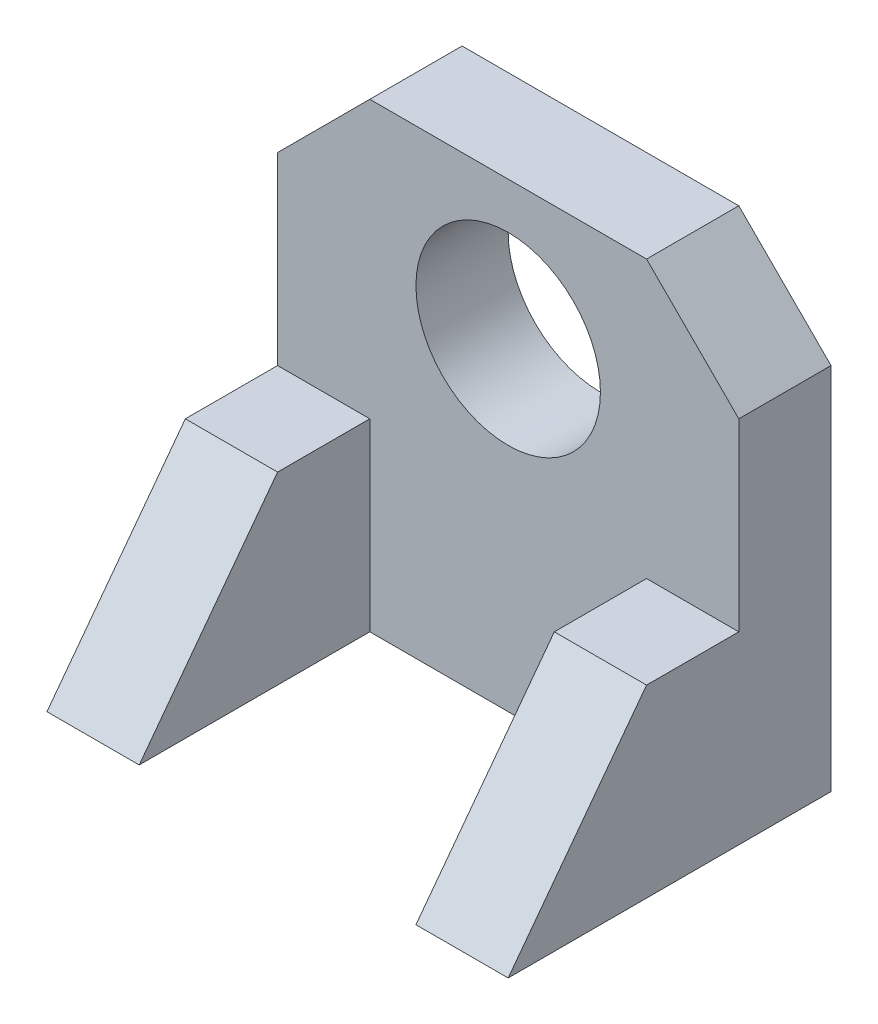
ISO-10303-21;
HEADER;
FILE_DESCRIPTION(('STEP AP214'),'2;1');
FILE_NAME('part.step','',(''),(''),'','','');
FILE_SCHEMA(('AUTOMOTIVE_DESIGN { 1 0 10303 214 1 1 1 1 }'));
ENDSEC;
DATA;
#1=APPLICATION_CONTEXT('core data for automotive mechanical design processes');
#2=APPLICATION_PROTOCOL_DEFINITION('international standard','automotive_design',2000,#1);
#3=PRODUCT_CONTEXT('',#1,'mechanical');
#4=PRODUCT('Part','Part','',(#3));
#5=PRODUCT_RELATED_PRODUCT_CATEGORY('part','',(#4));
#6=PRODUCT_DEFINITION_FORMATION('','',#4);
#7=PRODUCT_DEFINITION_CONTEXT('part definition',#1,'design');
#8=PRODUCT_DEFINITION('design','',#6,#7);
#9=PRODUCT_DEFINITION_SHAPE('','',#8);
#10=(LENGTH_UNIT() NAMED_UNIT(*) SI_UNIT(.MILLI.,.METRE.));
#11=(NAMED_UNIT(*) PLANE_ANGLE_UNIT() SI_UNIT($,.RADIAN.));
#12=(NAMED_UNIT(*) SI_UNIT($,.STERADIAN.) SOLID_ANGLE_UNIT());
#13=UNCERTAINTY_MEASURE_WITH_UNIT(LENGTH_MEASURE(1.E-05),#10,'distance_accuracy_value','');
#14=(GEOMETRIC_REPRESENTATION_CONTEXT(3) GLOBAL_UNCERTAINTY_ASSIGNED_CONTEXT((#13)) GLOBAL_UNIT_ASSIGNED_CONTEXT((#10,
#11,#12)) REPRESENTATION_CONTEXT('',''));
#15=CARTESIAN_POINT('',(0.,0.,0.));
#16=DIRECTION('',(0.,0.,1.));
#17=DIRECTION('',(1.,0.,0.));
#18=AXIS2_PLACEMENT_3D('',#15,#16,#17);
#19=CARTESIAN_POINT('',(0.,0.,10.));
#20=DIRECTION('',(0.,0.,1.));
#21=DIRECTION('',(1.,0.,0.));
#22=AXIS2_PLACEMENT_3D('',#19,#20,#21);
#23=PLANE('',#22);
#24=DIRECTION('',(1.,0.,0.));
#25=VECTOR('',#24,1.);
#26=CARTESIAN_POINT('',(-25.,20.,10.));
#27=LINE('',#26,#25);
#28=CARTESIAN_POINT('',(-25.,20.,10.));
#29=VERTEX_POINT('',#28);
#30=CARTESIAN_POINT('',(-15.,20.,10.));
#31=VERTEX_POINT('',#30);
#32=EDGE_CURVE('E48',#29,#31,#27,.T.);
#33=ORIENTED_EDGE('',*,*,#32,.T.);
#34=DIRECTION('',(0.,1.,0.));
#35=VECTOR('',#34,1.);
#36=CARTESIAN_POINT('',(-15.,20.,10.));
#37=LINE('',#36,#35);
#38=CARTESIAN_POINT('',(-15.,0.,10.));
#39=VERTEX_POINT('',#38);
#40=EDGE_CURVE('E156',#39,#31,#37,.T.);
#41=ORIENTED_EDGE('',*,*,#40,.F.);
#42=DIRECTION('',(1.,0.,0.));
#43=VECTOR('',#42,1.);
#44=CARTESIAN_POINT('',(-25.,0.,10.));
#45=LINE('',#44,#43);
#46=CARTESIAN_POINT('',(15.,0.,10.));
#47=VERTEX_POINT('',#46);
#48=EDGE_CURVE('E201',#39,#47,#45,.T.);
#49=ORIENTED_EDGE('',*,*,#48,.T.);
#50=DIRECTION('',(0.,1.,0.));
#51=VECTOR('',#50,1.);
#52=CARTESIAN_POINT('',(15.,20.,10.));
#53=LINE('',#52,#51);
#54=CARTESIAN_POINT('',(15.,20.,10.));
#55=VERTEX_POINT('',#54);
#56=EDGE_CURVE('E144',#47,#55,#53,.T.);
#57=ORIENTED_EDGE('',*,*,#56,.T.);
#58=DIRECTION('',(-1.,0.,0.));
#59=VECTOR('',#58,1.);
#60=CARTESIAN_POINT('',(25.,20.,10.));
#61=LINE('',#60,#59);
#62=CARTESIAN_POINT('',(25.,20.,10.));
#63=VERTEX_POINT('',#62);
#64=EDGE_CURVE('E181',#63,#55,#61,.T.);
#65=ORIENTED_EDGE('',*,*,#64,.F.);
#66=DIRECTION('',(0.,1.,0.));
#67=VECTOR('',#66,1.);
#68=CARTESIAN_POINT('',(25.,40.,10.));
#69=LINE('',#68,#67);
#70=CARTESIAN_POINT('',(25.,40.,10.));
#71=VERTEX_POINT('',#70);
#72=EDGE_CURVE('E191',#63,#71,#69,.T.);
#73=ORIENTED_EDGE('',*,*,#72,.T.);
#74=DIRECTION('',(-0.707106781186547,0.707106781186548,0.));
#75=VECTOR('',#74,1.);
#76=CARTESIAN_POINT('',(15.,50.,10.));
#77=LINE('',#76,#75);
#78=CARTESIAN_POINT('',(15.,50.,10.));
#79=VERTEX_POINT('',#78);
#80=EDGE_CURVE('E193',#71,#79,#77,.T.);
#81=ORIENTED_EDGE('',*,*,#80,.T.);
#82=DIRECTION('',(-1.,0.,0.));
#83=VECTOR('',#82,1.);
#84=CARTESIAN_POINT('',(-15.,50.,10.));
#85=LINE('',#84,#83);
#86=CARTESIAN_POINT('',(-15.,50.,10.));
#87=VERTEX_POINT('',#86);
#88=EDGE_CURVE('E196',#79,#87,#85,.T.);
#89=ORIENTED_EDGE('',*,*,#88,.T.);
#90=DIRECTION('',(-0.707106781186547,-0.707106781186548,0.));
#91=VECTOR('',#90,1.);
#92=CARTESIAN_POINT('',(-25.,40.,10.));
#93=LINE('',#92,#91);
#94=CARTESIAN_POINT('',(-25.,40.,10.));
#95=VERTEX_POINT('',#94);
#96=EDGE_CURVE('E198',#87,#95,#93,.T.);
#97=ORIENTED_EDGE('',*,*,#96,.T.);
#98=DIRECTION('',(0.,-1.,0.));
#99=VECTOR('',#98,1.);
#100=CARTESIAN_POINT('',(-25.,0.,10.));
#101=LINE('',#100,#99);
#102=EDGE_CURVE('E53',#95,#29,#101,.T.);
#103=ORIENTED_EDGE('',*,*,#102,.T.);
#104=EDGE_LOOP('',(#33,#41,#49,#57,#65,#73,#81,#89,#97,#103));
#105=FACE_BOUND('',#104,.T.);
#106=CARTESIAN_POINT('',(0.,35.,10.));
#107=DIRECTION('',(0.,0.,1.));
#108=DIRECTION('',(1.,0.,0.));
#109=AXIS2_PLACEMENT_3D('',#106,#107,#108);
#110=CIRCLE('',#109,10.);
#111=CARTESIAN_POINT('',(10.,35.,10.));
#112=VERTEX_POINT('',#111);
#113=EDGE_CURVE('E185',#112,#112,#110,.T.);
#114=ORIENTED_EDGE('',*,*,#113,.F.);
#115=EDGE_LOOP('',(#114));
#116=FACE_BOUND('',#115,.T.);
#117=ADVANCED_FACE('F33',(#105,#116),#23,.T.);
#118=CARTESIAN_POINT('',(0.,0.,0.));
#119=DIRECTION('',(0.,0.,1.));
#120=DIRECTION('',(1.,0.,0.));
#121=AXIS2_PLACEMENT_3D('',#118,#119,#120);
#122=PLANE('',#121);
#123=DIRECTION('',(0.,1.,0.));
#124=VECTOR('',#123,1.);
#125=CARTESIAN_POINT('',(25.,40.,0.));
#126=LINE('',#125,#124);
#127=CARTESIAN_POINT('',(25.,0.,0.));
#128=VERTEX_POINT('',#127);
#129=CARTESIAN_POINT('',(25.,40.,0.));
#130=VERTEX_POINT('',#129);
#131=EDGE_CURVE('E188',#128,#130,#126,.T.);
#132=ORIENTED_EDGE('',*,*,#131,.F.);
#133=DIRECTION('',(1.,0.,0.));
#134=VECTOR('',#133,1.);
#135=CARTESIAN_POINT('',(-25.,0.,0.));
#136=LINE('',#135,#134);
#137=CARTESIAN_POINT('',(-25.,0.,0.));
#138=VERTEX_POINT('',#137);
#139=EDGE_CURVE('E194',#138,#128,#136,.T.);
#140=ORIENTED_EDGE('',*,*,#139,.F.);
#141=DIRECTION('',(0.,-1.,0.));
#142=VECTOR('',#141,1.);
#143=CARTESIAN_POINT('',(-25.,0.,0.));
#144=LINE('',#143,#142);
#145=CARTESIAN_POINT('',(-25.,40.,0.));
#146=VERTEX_POINT('',#145);
#147=EDGE_CURVE('E130',#146,#138,#144,.T.);
#148=ORIENTED_EDGE('',*,*,#147,.F.);
#149=DIRECTION('',(-0.707106781186547,-0.707106781186548,0.));
#150=VECTOR('',#149,1.);
#151=CARTESIAN_POINT('',(-25.,40.,0.));
#152=LINE('',#151,#150);
#153=CARTESIAN_POINT('',(-15.,50.,0.));
#154=VERTEX_POINT('',#153);
#155=EDGE_CURVE('E209',#154,#146,#152,.T.);
#156=ORIENTED_EDGE('',*,*,#155,.F.);
#157=DIRECTION('',(-1.,0.,0.));
#158=VECTOR('',#157,1.);
#159=CARTESIAN_POINT('',(-15.,50.,0.));
#160=LINE('',#159,#158);
#161=CARTESIAN_POINT('',(15.,50.,0.));
#162=VERTEX_POINT('',#161);
#163=EDGE_CURVE('E207',#162,#154,#160,.T.);
#164=ORIENTED_EDGE('',*,*,#163,.F.);
#165=DIRECTION('',(-0.707106781186547,0.707106781186548,0.));
#166=VECTOR('',#165,1.);
#167=CARTESIAN_POINT('',(15.,50.,0.));
#168=LINE('',#167,#166);
#169=EDGE_CURVE('E205',#130,#162,#168,.T.);
#170=ORIENTED_EDGE('',*,*,#169,.F.);
#171=EDGE_LOOP('',(#132,#140,#148,#156,#164,#170));
#172=FACE_BOUND('',#171,.T.);
#173=CARTESIAN_POINT('',(0.,35.,0.));
#174=DIRECTION('',(0.,0.,1.));
#175=DIRECTION('',(1.,0.,0.));
#176=AXIS2_PLACEMENT_3D('',#173,#174,#175);
#177=CIRCLE('',#176,10.);
#178=CARTESIAN_POINT('',(10.,35.,0.));
#179=VERTEX_POINT('',#178);
#180=EDGE_CURVE('E184',#179,#179,#177,.T.);
#181=ORIENTED_EDGE('',*,*,#180,.T.);
#182=EDGE_LOOP('',(#181));
#183=FACE_BOUND('',#182,.T.);
#184=ADVANCED_FACE('F230',(#172,#183),#122,.F.);
#185=CARTESIAN_POINT('',(25.,40.,10.));
#186=DIRECTION('',(-1.,0.,0.));
#187=DIRECTION('',(0.,0.,1.));
#188=AXIS2_PLACEMENT_3D('',#185,#186,#187);
#189=PLANE('',#188);
#190=ORIENTED_EDGE('',*,*,#131,.T.);
#191=DIRECTION('',(0.,0.,-1.));
#192=VECTOR('',#191,1.);
#193=CARTESIAN_POINT('',(25.,40.,10.));
#194=LINE('',#193,#192);
#195=EDGE_CURVE('E11',#71,#130,#194,.T.);
#196=ORIENTED_EDGE('',*,*,#195,.F.);
#197=ORIENTED_EDGE('',*,*,#72,.F.);
#198=DIRECTION('',(0.,0.,1.));
#199=VECTOR('',#198,1.);
#200=CARTESIAN_POINT('',(25.,20.,10.));
#201=LINE('',#200,#199);
#202=CARTESIAN_POINT('',(25.,20.,20.));
#203=VERTEX_POINT('',#202);
#204=EDGE_CURVE('E162',#63,#203,#201,.T.);
#205=ORIENTED_EDGE('',*,*,#204,.T.);
#206=DIRECTION('',(0.,-0.8,0.6));
#207=VECTOR('',#206,1.);
#208=CARTESIAN_POINT('',(25.,20.,20.));
#209=LINE('',#208,#207);
#210=CARTESIAN_POINT('',(25.,0.,35.));
#211=VERTEX_POINT('',#210);
#212=EDGE_CURVE('E164',#203,#211,#209,.T.);
#213=ORIENTED_EDGE('',*,*,#212,.T.);
#214=DIRECTION('',(0.,0.,-1.));
#215=VECTOR('',#214,1.);
#216=CARTESIAN_POINT('',(25.,0.,10.));
#217=LINE('',#216,#215);
#218=EDGE_CURVE('E134',#211,#128,#217,.T.);
#219=ORIENTED_EDGE('',*,*,#218,.T.);
#220=EDGE_LOOP('',(#190,#196,#197,#205,#213,#219));
#221=FACE_BOUND('',#220,.T.);
#222=ADVANCED_FACE('F35',(#221),#189,.F.);
#223=CARTESIAN_POINT('',(15.,50.,10.));
#224=DIRECTION('',(-0.707106781186548,-0.707106781186547,0.));
#225=DIRECTION('',(0.707106781186547,-0.707106781186548,0.));
#226=AXIS2_PLACEMENT_3D('',#223,#224,#225);
#227=PLANE('',#226);
#228=ORIENTED_EDGE('',*,*,#169,.T.);
#229=DIRECTION('',(0.,0.,-1.));
#230=VECTOR('',#229,1.);
#231=CARTESIAN_POINT('',(15.,50.,10.));
#232=LINE('',#231,#230);
#233=EDGE_CURVE('E41',#79,#162,#232,.T.);
#234=ORIENTED_EDGE('',*,*,#233,.F.);
#235=ORIENTED_EDGE('',*,*,#80,.F.);
#236=ORIENTED_EDGE('',*,*,#195,.T.);
#237=EDGE_LOOP('',(#228,#234,#235,#236));
#238=FACE_BOUND('',#237,.T.);
#239=ADVANCED_FACE('F256',(#238),#227,.F.);
#240=CARTESIAN_POINT('',(-15.,50.,10.));
#241=DIRECTION('',(0.,-1.,0.));
#242=DIRECTION('',(0.,0.,-1.));
#243=AXIS2_PLACEMENT_3D('',#240,#241,#242);
#244=PLANE('',#243);
#245=ORIENTED_EDGE('',*,*,#163,.T.);
#246=DIRECTION('',(0.,0.,-1.));
#247=VECTOR('',#246,1.);
#248=CARTESIAN_POINT('',(-15.,50.,10.));
#249=LINE('',#248,#247);
#250=EDGE_CURVE('E216',#87,#154,#249,.T.);
#251=ORIENTED_EDGE('',*,*,#250,.F.);
#252=ORIENTED_EDGE('',*,*,#88,.F.);
#253=ORIENTED_EDGE('',*,*,#233,.T.);
#254=EDGE_LOOP('',(#245,#251,#252,#253));
#255=FACE_BOUND('',#254,.T.);
#256=ADVANCED_FACE('F223',(#255),#244,.F.);
#257=CARTESIAN_POINT('',(-25.,40.,10.));
#258=DIRECTION('',(0.707106781186548,-0.707106781186547,0.));
#259=DIRECTION('',(0.707106781186547,0.707106781186548,0.));
#260=AXIS2_PLACEMENT_3D('',#257,#258,#259);
#261=PLANE('',#260);
#262=ORIENTED_EDGE('',*,*,#155,.T.);
#263=DIRECTION('',(0.,0.,-1.));
#264=VECTOR('',#263,1.);
#265=CARTESIAN_POINT('',(-25.,40.,10.));
#266=LINE('',#265,#264);
#267=EDGE_CURVE('E133',#95,#146,#266,.T.);
#268=ORIENTED_EDGE('',*,*,#267,.F.);
#269=ORIENTED_EDGE('',*,*,#96,.F.);
#270=ORIENTED_EDGE('',*,*,#250,.T.);
#271=EDGE_LOOP('',(#262,#268,#269,#270));
#272=FACE_BOUND('',#271,.T.);
#273=ADVANCED_FACE('F234',(#272),#261,.F.);
#274=CARTESIAN_POINT('',(-25.,0.,10.));
#275=DIRECTION('',(1.,0.,0.));
#276=DIRECTION('',(0.,0.,-1.));
#277=AXIS2_PLACEMENT_3D('',#274,#275,#276);
#278=PLANE('',#277);
#279=ORIENTED_EDGE('',*,*,#147,.T.);
#280=DIRECTION('',(0.,0.,-1.));
#281=VECTOR('',#280,1.);
#282=CARTESIAN_POINT('',(-25.,0.,10.));
#283=LINE('',#282,#281);
#284=CARTESIAN_POINT('',(-25.,0.,35.));
#285=VERTEX_POINT('',#284);
#286=EDGE_CURVE('E121',#285,#138,#283,.T.);
#287=ORIENTED_EDGE('',*,*,#286,.F.);
#288=DIRECTION('',(0.,-0.8,0.6));
#289=VECTOR('',#288,1.);
#290=CARTESIAN_POINT('',(-25.,20.,20.));
#291=LINE('',#290,#289);
#292=CARTESIAN_POINT('',(-25.,20.,20.));
#293=VERTEX_POINT('',#292);
#294=EDGE_CURVE('E126',#293,#285,#291,.T.);
#295=ORIENTED_EDGE('',*,*,#294,.F.);
#296=DIRECTION('',(0.,0.,1.));
#297=VECTOR('',#296,1.);
#298=CARTESIAN_POINT('',(-25.,20.,10.));
#299=LINE('',#298,#297);
#300=EDGE_CURVE('E148',#29,#293,#299,.T.);
#301=ORIENTED_EDGE('',*,*,#300,.F.);
#302=ORIENTED_EDGE('',*,*,#102,.F.);
#303=ORIENTED_EDGE('',*,*,#267,.T.);
#304=EDGE_LOOP('',(#279,#287,#295,#301,#302,#303));
#305=FACE_BOUND('',#304,.T.);
#306=ADVANCED_FACE('F123',(#305),#278,.F.);
#307=CARTESIAN_POINT('',(-25.,0.,10.));
#308=DIRECTION('',(0.,1.,0.));
#309=DIRECTION('',(0.,0.,1.));
#310=AXIS2_PLACEMENT_3D('',#307,#308,#309);
#311=PLANE('',#310);
#312=ORIENTED_EDGE('',*,*,#139,.T.);
#313=ORIENTED_EDGE('',*,*,#218,.F.);
#314=DIRECTION('',(-1.,0.,0.));
#315=VECTOR('',#314,1.);
#316=CARTESIAN_POINT('',(25.,0.,35.));
#317=LINE('',#316,#315);
#318=CARTESIAN_POINT('',(15.,0.,35.));
#319=VERTEX_POINT('',#318);
#320=EDGE_CURVE('E168',#211,#319,#317,.T.);
#321=ORIENTED_EDGE('',*,*,#320,.T.);
#322=DIRECTION('',(0.,0.,-1.));
#323=VECTOR('',#322,1.);
#324=CARTESIAN_POINT('',(15.,0.,35.));
#325=LINE('',#324,#323);
#326=EDGE_CURVE('E165',#319,#47,#325,.T.);
#327=ORIENTED_EDGE('',*,*,#326,.T.);
#328=ORIENTED_EDGE('',*,*,#48,.F.);
#329=DIRECTION('',(0.,0.,-1.));
#330=VECTOR('',#329,1.);
#331=CARTESIAN_POINT('',(-15.,0.,35.));
#332=LINE('',#331,#330);
#333=CARTESIAN_POINT('',(-15.,0.,35.));
#334=VERTEX_POINT('',#333);
#335=EDGE_CURVE('E140',#334,#39,#332,.T.);
#336=ORIENTED_EDGE('',*,*,#335,.F.);
#337=DIRECTION('',(1.,0.,0.));
#338=VECTOR('',#337,1.);
#339=CARTESIAN_POINT('',(-25.,0.,35.));
#340=LINE('',#339,#338);
#341=EDGE_CURVE('E137',#285,#334,#340,.T.);
#342=ORIENTED_EDGE('',*,*,#341,.F.);
#343=ORIENTED_EDGE('',*,*,#286,.T.);
#344=EDGE_LOOP('',(#312,#313,#321,#327,#328,#336,#342,#343));
#345=FACE_BOUND('',#344,.T.);
#346=ADVANCED_FACE('F138',(#345),#311,.F.);
#347=CARTESIAN_POINT('',(0.,35.,10.));
#348=DIRECTION('',(0.,0.,-1.));
#349=DIRECTION('',(-1.,0.,0.));
#350=AXIS2_PLACEMENT_3D('',#347,#348,#349);
#351=CYLINDRICAL_SURFACE('',#350,10.);
#352=ORIENTED_EDGE('',*,*,#113,.T.);
#353=EDGE_LOOP('',(#352));
#354=FACE_BOUND('',#353,.T.);
#355=ORIENTED_EDGE('',*,*,#180,.F.);
#356=EDGE_LOOP('',(#355));
#357=FACE_BOUND('',#356,.T.);
#358=ADVANCED_FACE('F270',(#354,#357),#351,.F.);
#359=CARTESIAN_POINT('',(25.,20.,10.));
#360=DIRECTION('',(0.,-1.,0.));
#361=DIRECTION('',(0.,0.,-1.));
#362=AXIS2_PLACEMENT_3D('',#359,#360,#361);
#363=PLANE('',#362);
#364=DIRECTION('',(0.,0.,1.));
#365=VECTOR('',#364,1.);
#366=CARTESIAN_POINT('',(15.,20.,10.));
#367=LINE('',#366,#365);
#368=CARTESIAN_POINT('',(15.,20.,20.));
#369=VERTEX_POINT('',#368);
#370=EDGE_CURVE('E170',#55,#369,#367,.T.);
#371=ORIENTED_EDGE('',*,*,#370,.T.);
#372=DIRECTION('',(-1.,0.,0.));
#373=VECTOR('',#372,1.);
#374=CARTESIAN_POINT('',(25.,20.,20.));
#375=LINE('',#374,#373);
#376=EDGE_CURVE('E178',#203,#369,#375,.T.);
#377=ORIENTED_EDGE('',*,*,#376,.F.);
#378=ORIENTED_EDGE('',*,*,#204,.F.);
#379=ORIENTED_EDGE('',*,*,#64,.T.);
#380=EDGE_LOOP('',(#371,#377,#378,#379));
#381=FACE_BOUND('',#380,.T.);
#382=ADVANCED_FACE('F252',(#381),#363,.F.);
#383=CARTESIAN_POINT('',(25.,20.,20.));
#384=DIRECTION('',(0.,-0.6,-0.8));
#385=DIRECTION('',(0.,0.8,-0.6));
#386=AXIS2_PLACEMENT_3D('',#383,#384,#385);
#387=PLANE('',#386);
#388=DIRECTION('',(0.,-0.8,0.6));
#389=VECTOR('',#388,1.);
#390=CARTESIAN_POINT('',(15.,20.,20.));
#391=LINE('',#390,#389);
#392=EDGE_CURVE('E172',#369,#319,#391,.T.);
#393=ORIENTED_EDGE('',*,*,#392,.T.);
#394=ORIENTED_EDGE('',*,*,#320,.F.);
#395=ORIENTED_EDGE('',*,*,#212,.F.);
#396=ORIENTED_EDGE('',*,*,#376,.T.);
#397=EDGE_LOOP('',(#393,#394,#395,#396));
#398=FACE_BOUND('',#397,.T.);
#399=ADVANCED_FACE('F304',(#398),#387,.F.);
#400=CARTESIAN_POINT('',(15.,0.,0.));
#401=DIRECTION('',(1.,0.,0.));
#402=DIRECTION('',(0.,0.,-1.));
#403=AXIS2_PLACEMENT_3D('',#400,#401,#402);
#404=PLANE('',#403);
#405=ORIENTED_EDGE('',*,*,#56,.F.);
#406=ORIENTED_EDGE('',*,*,#326,.F.);
#407=ORIENTED_EDGE('',*,*,#392,.F.);
#408=ORIENTED_EDGE('',*,*,#370,.F.);
#409=EDGE_LOOP('',(#405,#406,#407,#408));
#410=FACE_BOUND('',#409,.T.);
#411=ADVANCED_FACE('F248',(#410),#404,.F.);
#412=CARTESIAN_POINT('',(-25.,20.,20.));
#413=DIRECTION('',(0.,0.6,0.8));
#414=DIRECTION('',(0.,-0.8,0.6));
#415=AXIS2_PLACEMENT_3D('',#412,#413,#414);
#416=PLANE('',#415);
#417=DIRECTION('',(0.,-0.8,0.6));
#418=VECTOR('',#417,1.);
#419=CARTESIAN_POINT('',(-15.,20.,20.));
#420=LINE('',#419,#418);
#421=CARTESIAN_POINT('',(-15.,20.,20.));
#422=VERTEX_POINT('',#421);
#423=EDGE_CURVE('E153',#422,#334,#420,.T.);
#424=ORIENTED_EDGE('',*,*,#423,.F.);
#425=DIRECTION('',(1.,0.,0.));
#426=VECTOR('',#425,1.);
#427=CARTESIAN_POINT('',(-25.,20.,20.));
#428=LINE('',#427,#426);
#429=EDGE_CURVE('E145',#293,#422,#428,.T.);
#430=ORIENTED_EDGE('',*,*,#429,.F.);
#431=ORIENTED_EDGE('',*,*,#294,.T.);
#432=ORIENTED_EDGE('',*,*,#341,.T.);
#433=EDGE_LOOP('',(#424,#430,#431,#432));
#434=FACE_BOUND('',#433,.T.);
#435=ADVANCED_FACE('F147',(#434),#416,.T.);
#436=CARTESIAN_POINT('',(-25.,20.,10.));
#437=DIRECTION('',(0.,1.,0.));
#438=DIRECTION('',(0.,0.,1.));
#439=AXIS2_PLACEMENT_3D('',#436,#437,#438);
#440=PLANE('',#439);
#441=DIRECTION('',(0.,0.,1.));
#442=VECTOR('',#441,1.);
#443=CARTESIAN_POINT('',(-15.,20.,10.));
#444=LINE('',#443,#442);
#445=EDGE_CURVE('E149',#31,#422,#444,.T.);
#446=ORIENTED_EDGE('',*,*,#445,.F.);
#447=ORIENTED_EDGE('',*,*,#32,.F.);
#448=ORIENTED_EDGE('',*,*,#300,.T.);
#449=ORIENTED_EDGE('',*,*,#429,.T.);
#450=EDGE_LOOP('',(#446,#447,#448,#449));
#451=FACE_BOUND('',#450,.T.);
#452=ADVANCED_FACE('F238',(#451),#440,.T.);
#453=CARTESIAN_POINT('',(-15.,0.,0.));
#454=DIRECTION('',(-1.,0.,0.));
#455=DIRECTION('',(0.,0.,-1.));
#456=AXIS2_PLACEMENT_3D('',#453,#454,#455);
#457=PLANE('',#456);
#458=ORIENTED_EDGE('',*,*,#40,.T.);
#459=ORIENTED_EDGE('',*,*,#445,.T.);
#460=ORIENTED_EDGE('',*,*,#423,.T.);
#461=ORIENTED_EDGE('',*,*,#335,.T.);
#462=EDGE_LOOP('',(#458,#459,#460,#461));
#463=FACE_BOUND('',#462,.T.);
#464=ADVANCED_FACE('F240',(#463),#457,.F.);
#465=CLOSED_SHELL('',(#117,#184,#222,#239,#256,#273,#306,#346,#358,#382,#399,#411,#435,#452,#464));
#466=MANIFOLD_SOLID_BREP('B2',#465);
#467=ADVANCED_BREP_SHAPE_REPRESENTATION('',(#18,#466),#14);
#468=SHAPE_DEFINITION_REPRESENTATION(#9,#467);
ENDSEC;
END-ISO-10303-21;
